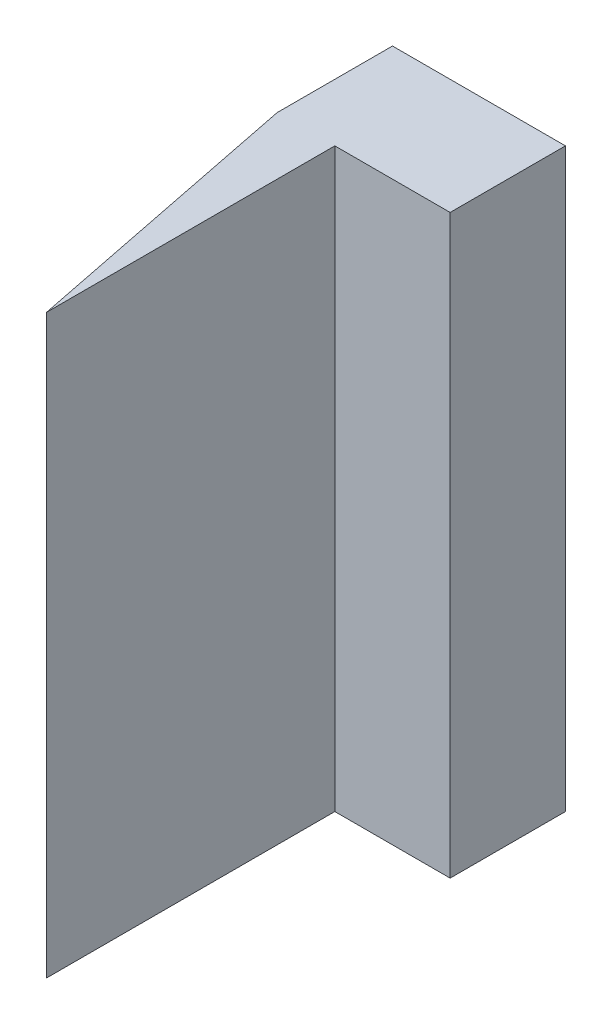
ISO-10303-21;
HEADER;
FILE_DESCRIPTION(('STEP AP214'),'2;1');
FILE_NAME('part.step','',(''),(''),'','','');
FILE_SCHEMA(('AUTOMOTIVE_DESIGN { 1 0 10303 214 1 1 1 1 }'));
ENDSEC;
DATA;
#1=APPLICATION_CONTEXT('core data for automotive mechanical design processes');
#2=APPLICATION_PROTOCOL_DEFINITION('international standard','automotive_design',2000,#1);
#3=PRODUCT_CONTEXT('',#1,'mechanical');
#4=PRODUCT('Part','Part','',(#3));
#5=PRODUCT_RELATED_PRODUCT_CATEGORY('part','',(#4));
#6=PRODUCT_DEFINITION_FORMATION('','',#4);
#7=PRODUCT_DEFINITION_CONTEXT('part definition',#1,'design');
#8=PRODUCT_DEFINITION('design','',#6,#7);
#9=PRODUCT_DEFINITION_SHAPE('','',#8);
#10=(LENGTH_UNIT() NAMED_UNIT(*) SI_UNIT(.MILLI.,.METRE.));
#11=(NAMED_UNIT(*) PLANE_ANGLE_UNIT() SI_UNIT($,.RADIAN.));
#12=(NAMED_UNIT(*) SI_UNIT($,.STERADIAN.) SOLID_ANGLE_UNIT());
#13=UNCERTAINTY_MEASURE_WITH_UNIT(LENGTH_MEASURE(1.E-05),#10,'distance_accuracy_value','');
#14=(GEOMETRIC_REPRESENTATION_CONTEXT(3) GLOBAL_UNCERTAINTY_ASSIGNED_CONTEXT((#13)) GLOBAL_UNIT_ASSIGNED_CONTEXT((#10,
#11,#12)) REPRESENTATION_CONTEXT('',''));
#15=CARTESIAN_POINT('',(0.,0.,0.));
#16=DIRECTION('',(0.,0.,1.));
#17=DIRECTION('',(1.,0.,0.));
#18=AXIS2_PLACEMENT_3D('',#15,#16,#17);
#19=CARTESIAN_POINT('',(10.,-25.,-7.5));
#20=DIRECTION('',(-1.,0.,0.));
#21=DIRECTION('',(0.,0.,1.));
#22=AXIS2_PLACEMENT_3D('',#19,#20,#21);
#23=PLANE('',#22);
#24=DIRECTION('',(0.,0.,-1.));
#25=VECTOR('',#24,1.);
#26=CARTESIAN_POINT('',(10.,10.,-12.5));
#27=LINE('',#26,#25);
#28=CARTESIAN_POINT('',(10.,10.,-10.));
#29=VERTEX_POINT('',#28);
#30=CARTESIAN_POINT('',(10.,10.,-15.));
#31=VERTEX_POINT('',#30);
#32=EDGE_CURVE('E273',#29,#31,#27,.T.);
#33=ORIENTED_EDGE('',*,*,#32,.F.);
#34=DIRECTION('',(0.,-1.,0.));
#35=VECTOR('',#34,1.);
#36=CARTESIAN_POINT('',(10.,12.5,-10.));
#37=LINE('',#36,#35);
#38=CARTESIAN_POINT('',(10.,15.,-10.));
#39=VERTEX_POINT('',#38);
#40=EDGE_CURVE('E28',#39,#29,#37,.T.);
#41=ORIENTED_EDGE('',*,*,#40,.F.);
#42=DIRECTION('',(0.,0.,1.));
#43=VECTOR('',#42,1.);
#44=CARTESIAN_POINT('',(10.,15.,-12.5));
#45=LINE('',#44,#43);
#46=CARTESIAN_POINT('',(10.,15.,-15.));
#47=VERTEX_POINT('',#46);
#48=EDGE_CURVE('E187',#47,#39,#45,.T.);
#49=ORIENTED_EDGE('',*,*,#48,.F.);
#50=DIRECTION('',(0.,1.,0.));
#51=VECTOR('',#50,1.);
#52=CARTESIAN_POINT('',(10.,12.5,-15.));
#53=LINE('',#52,#51);
#54=EDGE_CURVE('E110',#31,#47,#53,.T.);
#55=ORIENTED_EDGE('',*,*,#54,.F.);
#56=EDGE_LOOP('',(#33,#41,#49,#55));
#57=FACE_BOUND('',#56,.T.);
#58=ADVANCED_FACE('F17',(#57),#23,.T.);
#59=CARTESIAN_POINT('',(10.,-25.,-7.5));
#60=DIRECTION('',(-1.,0.,0.));
#61=DIRECTION('',(0.,0.,1.));
#62=AXIS2_PLACEMENT_3D('',#59,#60,#61);
#63=PLANE('',#62);
#64=DIRECTION('',(0.,-1.,0.));
#65=VECTOR('',#64,1.);
#66=CARTESIAN_POINT('',(10.,-12.5,-10.));
#67=LINE('',#66,#65);
#68=CARTESIAN_POINT('',(10.,-10.,-10.));
#69=VERTEX_POINT('',#68);
#70=CARTESIAN_POINT('',(10.,-15.,-10.));
#71=VERTEX_POINT('',#70);
#72=EDGE_CURVE('E259',#69,#71,#67,.T.);
#73=ORIENTED_EDGE('',*,*,#72,.F.);
#74=DIRECTION('',(0.,0.,1.));
#75=VECTOR('',#74,1.);
#76=CARTESIAN_POINT('',(10.,-10.,-12.5));
#77=LINE('',#76,#75);
#78=CARTESIAN_POINT('',(10.,-10.,-15.));
#79=VERTEX_POINT('',#78);
#80=EDGE_CURVE('E303',#79,#69,#77,.T.);
#81=ORIENTED_EDGE('',*,*,#80,.F.);
#82=DIRECTION('',(0.,1.,0.));
#83=VECTOR('',#82,1.);
#84=CARTESIAN_POINT('',(10.,-12.5,-15.));
#85=LINE('',#84,#83);
#86=CARTESIAN_POINT('',(10.,-15.,-15.));
#87=VERTEX_POINT('',#86);
#88=EDGE_CURVE('E260',#87,#79,#85,.T.);
#89=ORIENTED_EDGE('',*,*,#88,.F.);
#90=DIRECTION('',(0.,0.,-1.));
#91=VECTOR('',#90,1.);
#92=CARTESIAN_POINT('',(10.,-15.,-12.5));
#93=LINE('',#92,#91);
#94=EDGE_CURVE('E245',#71,#87,#93,.T.);
#95=ORIENTED_EDGE('',*,*,#94,.F.);
#96=EDGE_LOOP('',(#73,#81,#89,#95));
#97=FACE_BOUND('',#96,.T.);
#98=ADVANCED_FACE('F442',(#97),#63,.T.);
#99=CARTESIAN_POINT('',(20.,0.,0.));
#100=DIRECTION('',(-1.,0.,0.));
#101=DIRECTION('',(0.,0.,1.));
#102=AXIS2_PLACEMENT_3D('',#99,#100,#101);
#103=PLANE('',#102);
#104=DIRECTION('',(0.,1.,0.));
#105=VECTOR('',#104,1.);
#106=CARTESIAN_POINT('',(20.,0.,-7.5));
#107=LINE('',#106,#105);
#108=CARTESIAN_POINT('',(20.,-25.,-7.5));
#109=VERTEX_POINT('',#108);
#110=CARTESIAN_POINT('',(20.,25.,-7.5));
#111=VERTEX_POINT('',#110);
#112=EDGE_CURVE('E11',#109,#111,#107,.T.);
#113=ORIENTED_EDGE('',*,*,#112,.F.);
#114=DIRECTION('',(0.,0.,1.));
#115=VECTOR('',#114,1.);
#116=CARTESIAN_POINT('',(20.,-25.,-12.5));
#117=LINE('',#116,#115);
#118=CARTESIAN_POINT('',(20.,-25.,-17.5));
#119=VERTEX_POINT('',#118);
#120=EDGE_CURVE('E270',#119,#109,#117,.T.);
#121=ORIENTED_EDGE('',*,*,#120,.F.);
#122=DIRECTION('',(0.,-1.,0.));
#123=VECTOR('',#122,1.);
#124=CARTESIAN_POINT('',(20.,0.,-17.5));
#125=LINE('',#124,#123);
#126=CARTESIAN_POINT('',(20.,25.,-17.5));
#127=VERTEX_POINT('',#126);
#128=EDGE_CURVE('E338',#127,#119,#125,.T.);
#129=ORIENTED_EDGE('',*,*,#128,.F.);
#130=DIRECTION('',(0.,0.,-1.));
#131=VECTOR('',#130,1.);
#132=CARTESIAN_POINT('',(20.,25.,-12.5));
#133=LINE('',#132,#131);
#134=EDGE_CURVE('E240',#111,#127,#133,.T.);
#135=ORIENTED_EDGE('',*,*,#134,.F.);
#136=EDGE_LOOP('',(#113,#121,#129,#135));
#137=FACE_BOUND('',#136,.T.);
#138=ADVANCED_FACE('F527',(#137),#103,.F.);
#139=CARTESIAN_POINT('',(20.,-25.,-7.5));
#140=DIRECTION('',(0.,0.,-1.));
#141=DIRECTION('',(0.,-1.,0.));
#142=AXIS2_PLACEMENT_3D('',#139,#140,#141);
#143=PLANE('',#142);
#144=DIRECTION('',(-1.,0.,0.));
#145=VECTOR('',#144,1.);
#146=CARTESIAN_POINT('',(15.,25.,-7.5));
#147=LINE('',#146,#145);
#148=CARTESIAN_POINT('',(10.,25.,-7.5));
#149=VERTEX_POINT('',#148);
#150=EDGE_CURVE('E235',#111,#149,#147,.T.);
#151=ORIENTED_EDGE('',*,*,#150,.T.);
#152=DIRECTION('',(0.,1.,0.));
#153=VECTOR('',#152,1.);
#154=CARTESIAN_POINT('',(10.,0.,-7.5));
#155=LINE('',#154,#153);
#156=CARTESIAN_POINT('',(10.,-25.,-7.5));
#157=VERTEX_POINT('',#156);
#158=EDGE_CURVE('E231',#157,#149,#155,.T.);
#159=ORIENTED_EDGE('',*,*,#158,.F.);
#160=DIRECTION('',(-1.,0.,0.));
#161=VECTOR('',#160,1.);
#162=CARTESIAN_POINT('',(15.,-25.,-7.5));
#163=LINE('',#162,#161);
#164=EDGE_CURVE('E265',#109,#157,#163,.T.);
#165=ORIENTED_EDGE('',*,*,#164,.F.);
#166=ORIENTED_EDGE('',*,*,#112,.T.);
#167=EDGE_LOOP('',(#151,#159,#165,#166));
#168=FACE_BOUND('',#167,.T.);
#169=ADVANCED_FACE('F522',(#168),#143,.F.);
#170=CARTESIAN_POINT('',(5.,-15.,-10.));
#171=DIRECTION('',(0.,0.,-1.));
#172=DIRECTION('',(0.,-1.,0.));
#173=AXIS2_PLACEMENT_3D('',#170,#171,#172);
#174=PLANE('',#173);
#175=CARTESIAN_POINT('',(7.5,12.5,-10.));
#176=DIRECTION('',(0.,0.,-1.));
#177=DIRECTION('',(1.,0.,0.));
#178=AXIS2_PLACEMENT_3D('',#175,#176,#177);
#179=CIRCLE('',#178,1.25);
#180=CARTESIAN_POINT('',(8.75,12.5,-10.));
#181=VERTEX_POINT('',#180);
#182=CARTESIAN_POINT('',(6.25,12.5,-10.));
#183=VERTEX_POINT('',#182);
#184=EDGE_CURVE('E224',#181,#183,#179,.T.);
#185=ORIENTED_EDGE('',*,*,#184,.F.);
#186=CARTESIAN_POINT('',(7.5,12.5,-10.));
#187=DIRECTION('',(0.,0.,-1.));
#188=DIRECTION('',(1.,0.,0.));
#189=AXIS2_PLACEMENT_3D('',#186,#187,#188);
#190=CIRCLE('',#189,1.25);
#191=EDGE_CURVE('E316',#183,#181,#190,.T.);
#192=ORIENTED_EDGE('',*,*,#191,.F.);
#193=EDGE_LOOP('',(#185,#192));
#194=FACE_BOUND('',#193,.T.);
#195=ORIENTED_EDGE('',*,*,#40,.T.);
#196=DIRECTION('',(1.,0.,0.));
#197=VECTOR('',#196,1.);
#198=CARTESIAN_POINT('',(7.5,10.,-10.));
#199=LINE('',#198,#197);
#200=CARTESIAN_POINT('',(5.,10.,-10.));
#201=VERTEX_POINT('',#200);
#202=EDGE_CURVE('E193',#201,#29,#199,.T.);
#203=ORIENTED_EDGE('',*,*,#202,.F.);
#204=DIRECTION('',(0.,-1.,0.));
#205=VECTOR('',#204,1.);
#206=CARTESIAN_POINT('',(5.,12.5,-10.));
#207=LINE('',#206,#205);
#208=CARTESIAN_POINT('',(5.,15.,-10.));
#209=VERTEX_POINT('',#208);
#210=EDGE_CURVE('E191',#209,#201,#207,.T.);
#211=ORIENTED_EDGE('',*,*,#210,.F.);
#212=DIRECTION('',(1.,0.,0.));
#213=VECTOR('',#212,1.);
#214=CARTESIAN_POINT('',(7.5,15.,-10.));
#215=LINE('',#214,#213);
#216=EDGE_CURVE('E180',#209,#39,#215,.T.);
#217=ORIENTED_EDGE('',*,*,#216,.T.);
#218=EDGE_LOOP('',(#195,#203,#211,#217));
#219=FACE_BOUND('',#218,.T.);
#220=ADVANCED_FACE('F192',(#194,#219),#174,.T.);
#221=CARTESIAN_POINT('',(5.,15.,-10.));
#222=DIRECTION('',(0.,-1.,0.));
#223=DIRECTION('',(0.,0.,-1.));
#224=AXIS2_PLACEMENT_3D('',#221,#222,#223);
#225=PLANE('',#224);
#226=ORIENTED_EDGE('',*,*,#48,.T.);
#227=ORIENTED_EDGE('',*,*,#216,.F.);
#228=DIRECTION('',(0.,0.,1.));
#229=VECTOR('',#228,1.);
#230=CARTESIAN_POINT('',(5.,15.,-12.5));
#231=LINE('',#230,#229);
#232=CARTESIAN_POINT('',(5.,15.,-15.));
#233=VERTEX_POINT('',#232);
#234=EDGE_CURVE('E185',#233,#209,#231,.T.);
#235=ORIENTED_EDGE('',*,*,#234,.F.);
#236=DIRECTION('',(1.,0.,0.));
#237=VECTOR('',#236,1.);
#238=CARTESIAN_POINT('',(7.5,15.,-15.));
#239=LINE('',#238,#237);
#240=EDGE_CURVE('E274',#233,#47,#239,.T.);
#241=ORIENTED_EDGE('',*,*,#240,.T.);
#242=EDGE_LOOP('',(#226,#227,#235,#241));
#243=FACE_BOUND('',#242,.T.);
#244=ADVANCED_FACE('F182',(#243),#225,.T.);
#245=CARTESIAN_POINT('',(5.,-10.,-15.));
#246=DIRECTION('',(0.,0.,1.));
#247=DIRECTION('',(1.,0.,0.));
#248=AXIS2_PLACEMENT_3D('',#245,#246,#247);
#249=PLANE('',#248);
#250=CARTESIAN_POINT('',(7.5,12.5,-15.));
#251=DIRECTION('',(0.,0.,-1.));
#252=DIRECTION('',(1.,0.,0.));
#253=AXIS2_PLACEMENT_3D('',#250,#251,#252);
#254=CIRCLE('',#253,1.25);
#255=CARTESIAN_POINT('',(8.75,12.5,-15.));
#256=VERTEX_POINT('',#255);
#257=CARTESIAN_POINT('',(6.25,12.5,-15.));
#258=VERTEX_POINT('',#257);
#259=EDGE_CURVE('E317',#256,#258,#254,.T.);
#260=ORIENTED_EDGE('',*,*,#259,.T.);
#261=CARTESIAN_POINT('',(7.5,12.5,-15.));
#262=DIRECTION('',(0.,0.,-1.));
#263=DIRECTION('',(1.,0.,0.));
#264=AXIS2_PLACEMENT_3D('',#261,#262,#263);
#265=CIRCLE('',#264,1.25);
#266=EDGE_CURVE('E325',#258,#256,#265,.T.);
#267=ORIENTED_EDGE('',*,*,#266,.T.);
#268=EDGE_LOOP('',(#260,#267));
#269=FACE_BOUND('',#268,.T.);
#270=ORIENTED_EDGE('',*,*,#54,.T.);
#271=ORIENTED_EDGE('',*,*,#240,.F.);
#272=DIRECTION('',(0.,1.,0.));
#273=VECTOR('',#272,1.);
#274=CARTESIAN_POINT('',(5.,12.5,-15.));
#275=LINE('',#274,#273);
#276=CARTESIAN_POINT('',(5.,10.,-15.));
#277=VERTEX_POINT('',#276);
#278=EDGE_CURVE('E203',#277,#233,#275,.T.);
#279=ORIENTED_EDGE('',*,*,#278,.F.);
#280=DIRECTION('',(1.,0.,0.));
#281=VECTOR('',#280,1.);
#282=CARTESIAN_POINT('',(7.5,10.,-15.));
#283=LINE('',#282,#281);
#284=EDGE_CURVE('E239',#277,#31,#283,.T.);
#285=ORIENTED_EDGE('',*,*,#284,.T.);
#286=EDGE_LOOP('',(#270,#271,#279,#285));
#287=FACE_BOUND('',#286,.T.);
#288=ADVANCED_FACE('F298',(#269,#287),#249,.T.);
#289=CARTESIAN_POINT('',(5.,10.,-15.));
#290=DIRECTION('',(0.,1.,0.));
#291=DIRECTION('',(1.,0.,0.));
#292=AXIS2_PLACEMENT_3D('',#289,#290,#291);
#293=PLANE('',#292);
#294=ORIENTED_EDGE('',*,*,#32,.T.);
#295=ORIENTED_EDGE('',*,*,#284,.F.);
#296=DIRECTION('',(0.,0.,-1.));
#297=VECTOR('',#296,1.);
#298=CARTESIAN_POINT('',(5.,10.,-12.5));
#299=LINE('',#298,#297);
#300=EDGE_CURVE('E210',#201,#277,#299,.T.);
#301=ORIENTED_EDGE('',*,*,#300,.F.);
#302=ORIENTED_EDGE('',*,*,#202,.T.);
#303=EDGE_LOOP('',(#294,#295,#301,#302));
#304=FACE_BOUND('',#303,.T.);
#305=ADVANCED_FACE('F301',(#304),#293,.T.);
#306=CARTESIAN_POINT('',(5.,-10.,-15.));
#307=DIRECTION('',(0.,1.,0.));
#308=DIRECTION('',(1.,0.,0.));
#309=AXIS2_PLACEMENT_3D('',#306,#307,#308);
#310=PLANE('',#309);
#311=ORIENTED_EDGE('',*,*,#80,.T.);
#312=DIRECTION('',(1.,0.,0.));
#313=VECTOR('',#312,1.);
#314=CARTESIAN_POINT('',(7.5,-10.,-10.));
#315=LINE('',#314,#313);
#316=CARTESIAN_POINT('',(5.,-10.,-10.));
#317=VERTEX_POINT('',#316);
#318=EDGE_CURVE('E250',#317,#69,#315,.T.);
#319=ORIENTED_EDGE('',*,*,#318,.F.);
#320=DIRECTION('',(0.,0.,1.));
#321=VECTOR('',#320,1.);
#322=CARTESIAN_POINT('',(5.,-10.,-12.5));
#323=LINE('',#322,#321);
#324=CARTESIAN_POINT('',(5.,-10.,-15.));
#325=VERTEX_POINT('',#324);
#326=EDGE_CURVE('E281',#325,#317,#323,.T.);
#327=ORIENTED_EDGE('',*,*,#326,.F.);
#328=DIRECTION('',(1.,0.,0.));
#329=VECTOR('',#328,1.);
#330=CARTESIAN_POINT('',(7.5,-10.,-15.));
#331=LINE('',#330,#329);
#332=EDGE_CURVE('E264',#325,#79,#331,.T.);
#333=ORIENTED_EDGE('',*,*,#332,.T.);
#334=EDGE_LOOP('',(#311,#319,#327,#333));
#335=FACE_BOUND('',#334,.T.);
#336=ADVANCED_FACE('F477',(#335),#310,.F.);
#337=CARTESIAN_POINT('',(5.,-10.,-15.));
#338=DIRECTION('',(0.,0.,1.));
#339=DIRECTION('',(1.,0.,0.));
#340=AXIS2_PLACEMENT_3D('',#337,#338,#339);
#341=PLANE('',#340);
#342=CARTESIAN_POINT('',(7.5,-12.5,-15.));
#343=DIRECTION('',(0.,0.,-1.));
#344=DIRECTION('',(1.,0.,0.));
#345=AXIS2_PLACEMENT_3D('',#342,#343,#344);
#346=CIRCLE('',#345,1.25);
#347=CARTESIAN_POINT('',(8.75,-12.5,-15.));
#348=VERTEX_POINT('',#347);
#349=CARTESIAN_POINT('',(6.25,-12.5,-15.));
#350=VERTEX_POINT('',#349);
#351=EDGE_CURVE('E216',#348,#350,#346,.T.);
#352=ORIENTED_EDGE('',*,*,#351,.T.);
#353=CARTESIAN_POINT('',(7.5,-12.5,-15.));
#354=DIRECTION('',(0.,0.,-1.));
#355=DIRECTION('',(1.,0.,0.));
#356=AXIS2_PLACEMENT_3D('',#353,#354,#355);
#357=CIRCLE('',#356,1.25);
#358=EDGE_CURVE('E221',#350,#348,#357,.T.);
#359=ORIENTED_EDGE('',*,*,#358,.T.);
#360=EDGE_LOOP('',(#352,#359));
#361=FACE_BOUND('',#360,.T.);
#362=ORIENTED_EDGE('',*,*,#88,.T.);
#363=ORIENTED_EDGE('',*,*,#332,.F.);
#364=DIRECTION('',(0.,1.,0.));
#365=VECTOR('',#364,1.);
#366=CARTESIAN_POINT('',(5.,-12.5,-15.));
#367=LINE('',#366,#365);
#368=CARTESIAN_POINT('',(5.,-15.,-15.));
#369=VERTEX_POINT('',#368);
#370=EDGE_CURVE('E285',#369,#325,#367,.T.);
#371=ORIENTED_EDGE('',*,*,#370,.F.);
#372=DIRECTION('',(1.,0.,0.));
#373=VECTOR('',#372,1.);
#374=CARTESIAN_POINT('',(7.5,-15.,-15.));
#375=LINE('',#374,#373);
#376=EDGE_CURVE('E249',#369,#87,#375,.T.);
#377=ORIENTED_EDGE('',*,*,#376,.T.);
#378=EDGE_LOOP('',(#362,#363,#371,#377));
#379=FACE_BOUND('',#378,.T.);
#380=ADVANCED_FACE('F429',(#361,#379),#341,.T.);
#381=CARTESIAN_POINT('',(5.,-15.,-10.));
#382=DIRECTION('',(0.,-1.,0.));
#383=DIRECTION('',(0.,0.,-1.));
#384=AXIS2_PLACEMENT_3D('',#381,#382,#383);
#385=PLANE('',#384);
#386=ORIENTED_EDGE('',*,*,#94,.T.);
#387=ORIENTED_EDGE('',*,*,#376,.F.);
#388=DIRECTION('',(0.,0.,-1.));
#389=VECTOR('',#388,1.);
#390=CARTESIAN_POINT('',(5.,-15.,-12.5));
#391=LINE('',#390,#389);
#392=CARTESIAN_POINT('',(5.,-15.,-10.));
#393=VERTEX_POINT('',#392);
#394=EDGE_CURVE('E312',#393,#369,#391,.T.);
#395=ORIENTED_EDGE('',*,*,#394,.F.);
#396=DIRECTION('',(1.,0.,0.));
#397=VECTOR('',#396,1.);
#398=CARTESIAN_POINT('',(7.5,-15.,-10.));
#399=LINE('',#398,#397);
#400=EDGE_CURVE('E255',#393,#71,#399,.T.);
#401=ORIENTED_EDGE('',*,*,#400,.T.);
#402=EDGE_LOOP('',(#386,#387,#395,#401));
#403=FACE_BOUND('',#402,.T.);
#404=ADVANCED_FACE('F423',(#403),#385,.F.);
#405=CARTESIAN_POINT('',(5.,-15.,-10.));
#406=DIRECTION('',(0.,0.,-1.));
#407=DIRECTION('',(0.,-1.,0.));
#408=AXIS2_PLACEMENT_3D('',#405,#406,#407);
#409=PLANE('',#408);
#410=CARTESIAN_POINT('',(7.5,-12.5,-10.));
#411=DIRECTION('',(0.,0.,-1.));
#412=DIRECTION('',(1.,0.,0.));
#413=AXIS2_PLACEMENT_3D('',#410,#411,#412);
#414=CIRCLE('',#413,1.25);
#415=CARTESIAN_POINT('',(8.75,-12.5,-10.));
#416=VERTEX_POINT('',#415);
#417=CARTESIAN_POINT('',(6.25,-12.5,-10.));
#418=VERTEX_POINT('',#417);
#419=EDGE_CURVE('E288',#416,#418,#414,.T.);
#420=ORIENTED_EDGE('',*,*,#419,.F.);
#421=CARTESIAN_POINT('',(7.5,-12.5,-10.));
#422=DIRECTION('',(0.,0.,-1.));
#423=DIRECTION('',(1.,0.,0.));
#424=AXIS2_PLACEMENT_3D('',#421,#422,#423);
#425=CIRCLE('',#424,1.25);
#426=EDGE_CURVE('E225',#418,#416,#425,.T.);
#427=ORIENTED_EDGE('',*,*,#426,.F.);
#428=EDGE_LOOP('',(#420,#427));
#429=FACE_BOUND('',#428,.T.);
#430=ORIENTED_EDGE('',*,*,#72,.T.);
#431=ORIENTED_EDGE('',*,*,#400,.F.);
#432=DIRECTION('',(0.,-1.,0.));
#433=VECTOR('',#432,1.);
#434=CARTESIAN_POINT('',(5.,-12.5,-10.));
#435=LINE('',#434,#433);
#436=EDGE_CURVE('E368',#317,#393,#435,.T.);
#437=ORIENTED_EDGE('',*,*,#436,.F.);
#438=ORIENTED_EDGE('',*,*,#318,.T.);
#439=EDGE_LOOP('',(#430,#431,#437,#438));
#440=FACE_BOUND('',#439,.T.);
#441=ADVANCED_FACE('F428',(#429,#440),#409,.T.);
#442=CARTESIAN_POINT('',(0.,-25.,-17.5));
#443=DIRECTION('',(0.,0.,-1.));
#444=DIRECTION('',(0.,-1.,0.));
#445=AXIS2_PLACEMENT_3D('',#442,#443,#444);
#446=PLANE('',#445);
#447=ORIENTED_EDGE('',*,*,#128,.T.);
#448=DIRECTION('',(1.,0.,0.));
#449=VECTOR('',#448,1.);
#450=CARTESIAN_POINT('',(12.5,-25.,-17.5));
#451=LINE('',#450,#449);
#452=CARTESIAN_POINT('',(5.,-25.,-17.5));
#453=VERTEX_POINT('',#452);
#454=EDGE_CURVE('E198',#453,#119,#451,.T.);
#455=ORIENTED_EDGE('',*,*,#454,.F.);
#456=DIRECTION('',(0.,-1.,0.));
#457=VECTOR('',#456,1.);
#458=CARTESIAN_POINT('',(5.,0.,-17.5));
#459=LINE('',#458,#457);
#460=CARTESIAN_POINT('',(5.,25.,-17.5));
#461=VERTEX_POINT('',#460);
#462=EDGE_CURVE('E277',#461,#453,#459,.T.);
#463=ORIENTED_EDGE('',*,*,#462,.F.);
#464=DIRECTION('',(1.,0.,0.));
#465=VECTOR('',#464,1.);
#466=CARTESIAN_POINT('',(12.5,25.,-17.5));
#467=LINE('',#466,#465);
#468=EDGE_CURVE('E244',#461,#127,#467,.T.);
#469=ORIENTED_EDGE('',*,*,#468,.T.);
#470=EDGE_LOOP('',(#447,#455,#463,#469));
#471=FACE_BOUND('',#470,.T.);
#472=ADVANCED_FACE('F487',(#471),#446,.T.);
#473=CARTESIAN_POINT('',(0.,25.,17.5));
#474=DIRECTION('',(0.,-1.,0.));
#475=DIRECTION('',(0.,0.,-1.));
#476=AXIS2_PLACEMENT_3D('',#473,#474,#475);
#477=PLANE('',#476);
#478=DIRECTION('',(0.196116135137992,0.,0.980580675690959));
#479=VECTOR('',#478,1.);
#480=CARTESIAN_POINT('',(7.5,25.,5.));
#481=LINE('',#480,#479);
#482=CARTESIAN_POINT('',(5.,25.,-7.5));
#483=VERTEX_POINT('',#482);
#484=CARTESIAN_POINT('',(10.,25.,17.5));
#485=VERTEX_POINT('',#484);
#486=EDGE_CURVE('E226',#483,#485,#481,.T.);
#487=ORIENTED_EDGE('',*,*,#486,.T.);
#488=DIRECTION('',(0.,0.,-1.));
#489=VECTOR('',#488,1.);
#490=CARTESIAN_POINT('',(10.,25.,5.));
#491=LINE('',#490,#489);
#492=EDGE_CURVE('E236',#485,#149,#491,.T.);
#493=ORIENTED_EDGE('',*,*,#492,.T.);
#494=ORIENTED_EDGE('',*,*,#150,.F.);
#495=ORIENTED_EDGE('',*,*,#134,.T.);
#496=ORIENTED_EDGE('',*,*,#468,.F.);
#497=DIRECTION('',(0.,0.,-1.));
#498=VECTOR('',#497,1.);
#499=CARTESIAN_POINT('',(5.,25.,-12.5));
#500=LINE('',#499,#498);
#501=EDGE_CURVE('E21',#483,#461,#500,.T.);
#502=ORIENTED_EDGE('',*,*,#501,.F.);
#503=EDGE_LOOP('',(#487,#493,#494,#495,#496,#502));
#504=FACE_BOUND('',#503,.T.);
#505=ADVANCED_FACE('F405',(#504),#477,.F.);
#506=CARTESIAN_POINT('',(10.,-25.,-7.5));
#507=DIRECTION('',(-1.,0.,0.));
#508=DIRECTION('',(0.,0.,1.));
#509=AXIS2_PLACEMENT_3D('',#506,#507,#508);
#510=PLANE('',#509);
#511=ORIENTED_EDGE('',*,*,#492,.F.);
#512=DIRECTION('',(0.,1.,0.));
#513=VECTOR('',#512,1.);
#514=CARTESIAN_POINT('',(10.,0.,17.5));
#515=LINE('',#514,#513);
#516=CARTESIAN_POINT('',(10.,-25.,17.5));
#517=VERTEX_POINT('',#516);
#518=EDGE_CURVE('E230',#517,#485,#515,.T.);
#519=ORIENTED_EDGE('',*,*,#518,.F.);
#520=DIRECTION('',(0.,0.,1.));
#521=VECTOR('',#520,1.);
#522=CARTESIAN_POINT('',(10.,-25.,5.));
#523=LINE('',#522,#521);
#524=EDGE_CURVE('E269',#157,#517,#523,.T.);
#525=ORIENTED_EDGE('',*,*,#524,.F.);
#526=ORIENTED_EDGE('',*,*,#158,.T.);
#527=EDGE_LOOP('',(#511,#519,#525,#526));
#528=FACE_BOUND('',#527,.T.);
#529=ADVANCED_FACE('F461',(#528),#510,.F.);
#530=CARTESIAN_POINT('',(0.,-25.,-17.5));
#531=DIRECTION('',(0.,1.,0.));
#532=DIRECTION('',(1.,0.,0.));
#533=AXIS2_PLACEMENT_3D('',#530,#531,#532);
#534=PLANE('',#533);
#535=DIRECTION('',(-0.196116135137992,0.,-0.980580675690959));
#536=VECTOR('',#535,1.);
#537=CARTESIAN_POINT('',(7.5,-25.,5.));
#538=LINE('',#537,#536);
#539=CARTESIAN_POINT('',(5.,-25.,-7.5));
#540=VERTEX_POINT('',#539);
#541=EDGE_CURVE('E324',#517,#540,#538,.T.);
#542=ORIENTED_EDGE('',*,*,#541,.T.);
#543=DIRECTION('',(0.,0.,1.));
#544=VECTOR('',#543,1.);
#545=CARTESIAN_POINT('',(5.,-25.,-12.5));
#546=LINE('',#545,#544);
#547=EDGE_CURVE('E214',#453,#540,#546,.T.);
#548=ORIENTED_EDGE('',*,*,#547,.F.);
#549=ORIENTED_EDGE('',*,*,#454,.T.);
#550=ORIENTED_EDGE('',*,*,#120,.T.);
#551=ORIENTED_EDGE('',*,*,#164,.T.);
#552=ORIENTED_EDGE('',*,*,#524,.T.);
#553=EDGE_LOOP('',(#542,#548,#549,#550,#551,#552));
#554=FACE_BOUND('',#553,.T.);
#555=ADVANCED_FACE('F398',(#554),#534,.F.);
#556=CARTESIAN_POINT('',(5.,0.,0.));
#557=DIRECTION('',(-1.,0.,0.));
#558=DIRECTION('',(0.,0.,1.));
#559=AXIS2_PLACEMENT_3D('',#556,#557,#558);
#560=PLANE('',#559);
#561=ORIENTED_EDGE('',*,*,#300,.T.);
#562=ORIENTED_EDGE('',*,*,#278,.T.);
#563=ORIENTED_EDGE('',*,*,#234,.T.);
#564=ORIENTED_EDGE('',*,*,#210,.T.);
#565=EDGE_LOOP('',(#561,#562,#563,#564));
#566=FACE_BOUND('',#565,.T.);
#567=ORIENTED_EDGE('',*,*,#436,.T.);
#568=ORIENTED_EDGE('',*,*,#394,.T.);
#569=ORIENTED_EDGE('',*,*,#370,.T.);
#570=ORIENTED_EDGE('',*,*,#326,.T.);
#571=EDGE_LOOP('',(#567,#568,#569,#570));
#572=FACE_BOUND('',#571,.T.);
#573=ORIENTED_EDGE('',*,*,#501,.T.);
#574=ORIENTED_EDGE('',*,*,#462,.T.);
#575=ORIENTED_EDGE('',*,*,#547,.T.);
#576=DIRECTION('',(0.,1.,0.));
#577=VECTOR('',#576,1.);
#578=CARTESIAN_POINT('',(5.,0.,-7.5));
#579=LINE('',#578,#577);
#580=EDGE_CURVE('E320',#540,#483,#579,.T.);
#581=ORIENTED_EDGE('',*,*,#580,.T.);
#582=EDGE_LOOP('',(#573,#574,#575,#581));
#583=FACE_BOUND('',#582,.T.);
#584=ADVANCED_FACE('F200',(#566,#572,#583),#560,.T.);
#585=CARTESIAN_POINT('',(5.,-25.,-7.5));
#586=DIRECTION('',(-0.980580675690959,0.,0.196116135137992));
#587=DIRECTION('',(0.,1.,0.));
#588=AXIS2_PLACEMENT_3D('',#585,#586,#587);
#589=PLANE('',#588);
#590=ORIENTED_EDGE('',*,*,#580,.F.);
#591=ORIENTED_EDGE('',*,*,#541,.F.);
#592=ORIENTED_EDGE('',*,*,#518,.T.);
#593=ORIENTED_EDGE('',*,*,#486,.F.);
#594=EDGE_LOOP('',(#590,#591,#592,#593));
#595=FACE_BOUND('',#594,.T.);
#596=ADVANCED_FACE('F403',(#595),#589,.T.);
#597=CARTESIAN_POINT('',(7.5,12.5,-12.5));
#598=DIRECTION('',(0.,0.,-1.));
#599=DIRECTION('',(1.,0.,0.));
#600=AXIS2_PLACEMENT_3D('',#597,#598,#599);
#601=CYLINDRICAL_SURFACE('',#600,1.25);
#602=ORIENTED_EDGE('',*,*,#191,.T.);
#603=DIRECTION('',(0.,0.,1.));
#604=VECTOR('',#603,1.);
#605=CARTESIAN_POINT('',(8.75,12.5,-12.5));
#606=LINE('',#605,#604);
#607=EDGE_CURVE('E313',#256,#181,#606,.T.);
#608=ORIENTED_EDGE('',*,*,#607,.F.);
#609=ORIENTED_EDGE('',*,*,#266,.F.);
#610=DIRECTION('',(0.,0.,1.));
#611=VECTOR('',#610,1.);
#612=CARTESIAN_POINT('',(6.25,12.5,-12.5));
#613=LINE('',#612,#611);
#614=EDGE_CURVE('E254',#258,#183,#613,.T.);
#615=ORIENTED_EDGE('',*,*,#614,.T.);
#616=EDGE_LOOP('',(#602,#608,#609,#615));
#617=FACE_BOUND('',#616,.T.);
#618=ADVANCED_FACE('F19',(#617),#601,.T.);
#619=CARTESIAN_POINT('',(7.5,12.5,-12.5));
#620=DIRECTION('',(0.,0.,-1.));
#621=DIRECTION('',(1.,0.,0.));
#622=AXIS2_PLACEMENT_3D('',#619,#620,#621);
#623=CYLINDRICAL_SURFACE('',#622,1.25);
#624=ORIENTED_EDGE('',*,*,#184,.T.);
#625=ORIENTED_EDGE('',*,*,#614,.F.);
#626=ORIENTED_EDGE('',*,*,#259,.F.);
#627=ORIENTED_EDGE('',*,*,#607,.T.);
#628=EDGE_LOOP('',(#624,#625,#626,#627));
#629=FACE_BOUND('',#628,.T.);
#630=ADVANCED_FACE('F544',(#629),#623,.T.);
#631=CARTESIAN_POINT('',(7.5,-12.5,-12.5));
#632=DIRECTION('',(0.,0.,-1.));
#633=DIRECTION('',(1.,0.,0.));
#634=AXIS2_PLACEMENT_3D('',#631,#632,#633);
#635=CYLINDRICAL_SURFACE('',#634,1.25);
#636=ORIENTED_EDGE('',*,*,#426,.T.);
#637=DIRECTION('',(0.,0.,1.));
#638=VECTOR('',#637,1.);
#639=CARTESIAN_POINT('',(8.75,-12.5,-12.5));
#640=LINE('',#639,#638);
#641=EDGE_CURVE('E219',#348,#416,#640,.T.);
#642=ORIENTED_EDGE('',*,*,#641,.F.);
#643=ORIENTED_EDGE('',*,*,#358,.F.);
#644=DIRECTION('',(0.,0.,1.));
#645=VECTOR('',#644,1.);
#646=CARTESIAN_POINT('',(6.25,-12.5,-12.5));
#647=LINE('',#646,#645);
#648=EDGE_CURVE('E220',#350,#418,#647,.T.);
#649=ORIENTED_EDGE('',*,*,#648,.T.);
#650=EDGE_LOOP('',(#636,#642,#643,#649));
#651=FACE_BOUND('',#650,.T.);
#652=ADVANCED_FACE('F549',(#651),#635,.T.);
#653=CARTESIAN_POINT('',(7.5,-12.5,-12.5));
#654=DIRECTION('',(0.,0.,-1.));
#655=DIRECTION('',(1.,0.,0.));
#656=AXIS2_PLACEMENT_3D('',#653,#654,#655);
#657=CYLINDRICAL_SURFACE('',#656,1.25);
#658=ORIENTED_EDGE('',*,*,#419,.T.);
#659=ORIENTED_EDGE('',*,*,#648,.F.);
#660=ORIENTED_EDGE('',*,*,#351,.F.);
#661=ORIENTED_EDGE('',*,*,#641,.T.);
#662=EDGE_LOOP('',(#658,#659,#660,#661));
#663=FACE_BOUND('',#662,.T.);
#664=ADVANCED_FACE('F600',(#663),#657,.T.);
#665=CLOSED_SHELL('',(#58,#98,#138,#169,#220,#244,#288,#305,#336,#380,#404,#441,#472,#505,#529,
#555,#584,#596,#618,#630,#652,#664));
#666=MANIFOLD_SOLID_BREP('B1',#665);
#667=ADVANCED_BREP_SHAPE_REPRESENTATION('',(#18,#666),#14);
#668=SHAPE_DEFINITION_REPRESENTATION(#9,#667);
ENDSEC;
END-ISO-10303-21;
